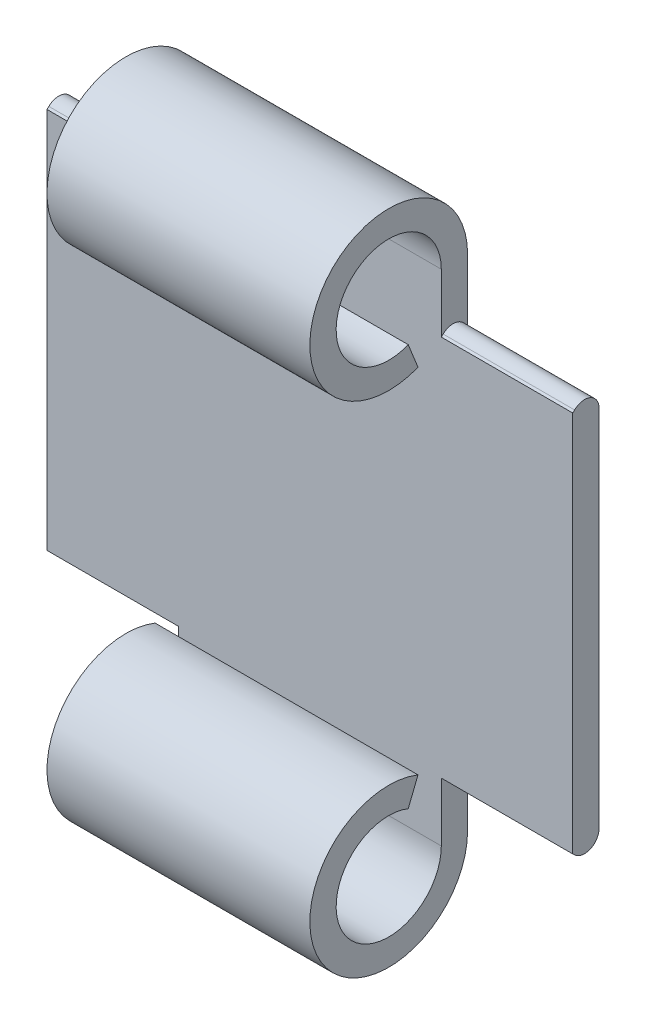
ISO-10303-21;
HEADER;
FILE_DESCRIPTION(('STEP AP214'),'2;1');
FILE_NAME('part.step','',(''),(''),'','','');
FILE_SCHEMA(('AUTOMOTIVE_DESIGN { 1 0 10303 214 1 1 1 1 }'));
ENDSEC;
DATA;
#1=APPLICATION_CONTEXT('core data for automotive mechanical design processes');
#2=APPLICATION_PROTOCOL_DEFINITION('international standard','automotive_design',2000,#1);
#3=PRODUCT_CONTEXT('',#1,'mechanical');
#4=PRODUCT('Part','Part','',(#3));
#5=PRODUCT_RELATED_PRODUCT_CATEGORY('part','',(#4));
#6=PRODUCT_DEFINITION_FORMATION('','',#4);
#7=PRODUCT_DEFINITION_CONTEXT('part definition',#1,'design');
#8=PRODUCT_DEFINITION('design','',#6,#7);
#9=PRODUCT_DEFINITION_SHAPE('','',#8);
#10=(LENGTH_UNIT() NAMED_UNIT(*) SI_UNIT(.MILLI.,.METRE.));
#11=(NAMED_UNIT(*) PLANE_ANGLE_UNIT() SI_UNIT($,.RADIAN.));
#12=(NAMED_UNIT(*) SI_UNIT($,.STERADIAN.) SOLID_ANGLE_UNIT());
#13=UNCERTAINTY_MEASURE_WITH_UNIT(LENGTH_MEASURE(1.E-05),#10,'distance_accuracy_value','');
#14=(GEOMETRIC_REPRESENTATION_CONTEXT(3) GLOBAL_UNCERTAINTY_ASSIGNED_CONTEXT((#13)) GLOBAL_UNIT_ASSIGNED_CONTEXT((#10,
#11,#12)) REPRESENTATION_CONTEXT('',''));
#15=CARTESIAN_POINT('',(0.,0.,0.));
#16=DIRECTION('',(0.,0.,1.));
#17=DIRECTION('',(1.,0.,0.));
#18=AXIS2_PLACEMENT_3D('',#15,#16,#17);
#19=CARTESIAN_POINT('',(0.,0.,2.));
#20=DIRECTION('',(0.,0.,-1.));
#21=DIRECTION('',(-1.,0.,0.));
#22=AXIS2_PLACEMENT_3D('',#19,#20,#21);
#23=PLANE('',#22);
#24=DIRECTION('',(-1.,0.,0.));
#25=VECTOR('',#24,1.);
#26=CARTESIAN_POINT('',(40.,39.5278640450004,2.));
#27=LINE('',#26,#25);
#28=CARTESIAN_POINT('',(30.,39.5278640450004,2.));
#29=VERTEX_POINT('',#28);
#30=CARTESIAN_POINT('',(40.,39.5278640450004,2.));
#31=VERTEX_POINT('',#30);
#32=EDGE_CURVE('E175',#29,#31,#27,.F.);
#33=ORIENTED_EDGE('',*,*,#32,.F.);
#34=DIRECTION('',(0.,-1.,0.));
#35=VECTOR('',#34,1.);
#36=CARTESIAN_POINT('',(30.,0.,2.));
#37=LINE('',#36,#35);
#38=CARTESIAN_POINT('',(30.,44.,1.99999999999993));
#39=VERTEX_POINT('',#38);
#40=EDGE_CURVE('E185',#39,#29,#37,.T.);
#41=ORIENTED_EDGE('',*,*,#40,.F.);
#42=DIRECTION('',(-1.,0.,0.));
#43=VECTOR('',#42,1.);
#44=CARTESIAN_POINT('',(30.,44.,1.99999999999994));
#45=LINE('',#44,#43);
#46=CARTESIAN_POINT('',(10.,44.,1.99999999999994));
#47=VERTEX_POINT('',#46);
#48=EDGE_CURVE('E320',#39,#47,#45,.T.);
#49=ORIENTED_EDGE('',*,*,#48,.T.);
#50=DIRECTION('',(0.,1.,0.));
#51=VECTOR('',#50,1.);
#52=CARTESIAN_POINT('',(10.,0.,2.));
#53=LINE('',#52,#51);
#54=CARTESIAN_POINT('',(10.,39.5278640450004,2.));
#55=VERTEX_POINT('',#54);
#56=EDGE_CURVE('E259',#55,#47,#53,.T.);
#57=ORIENTED_EDGE('',*,*,#56,.F.);
#58=DIRECTION('',(1.,0.,0.));
#59=VECTOR('',#58,1.);
#60=CARTESIAN_POINT('',(0.,39.5278640450004,2.));
#61=LINE('',#60,#59);
#62=CARTESIAN_POINT('',(0.,39.5278640450004,2.));
#63=VERTEX_POINT('',#62);
#64=EDGE_CURVE('E277',#55,#63,#61,.F.);
#65=ORIENTED_EDGE('',*,*,#64,.T.);
#66=DIRECTION('',(0.,-1.,0.));
#67=VECTOR('',#66,1.);
#68=CARTESIAN_POINT('',(0.,0.,2.));
#69=LINE('',#68,#67);
#70=CARTESIAN_POINT('',(0.,10.4721359549996,2.));
#71=VERTEX_POINT('',#70);
#72=EDGE_CURVE('E200',#63,#71,#69,.T.);
#73=ORIENTED_EDGE('',*,*,#72,.T.);
#74=DIRECTION('',(1.,0.,0.));
#75=VECTOR('',#74,1.);
#76=CARTESIAN_POINT('',(0.,10.4721359549996,2.));
#77=LINE('',#76,#75);
#78=CARTESIAN_POINT('',(10.,10.4721359549996,2.));
#79=VERTEX_POINT('',#78);
#80=EDGE_CURVE('E291',#79,#71,#77,.F.);
#81=ORIENTED_EDGE('',*,*,#80,.F.);
#82=DIRECTION('',(0.,1.,0.));
#83=VECTOR('',#82,1.);
#84=CARTESIAN_POINT('',(10.,0.,2.));
#85=LINE('',#84,#83);
#86=CARTESIAN_POINT('',(10.,6.,2.));
#87=VERTEX_POINT('',#86);
#88=EDGE_CURVE('E296',#87,#79,#85,.T.);
#89=ORIENTED_EDGE('',*,*,#88,.F.);
#90=DIRECTION('',(-1.,0.,0.));
#91=VECTOR('',#90,1.);
#92=CARTESIAN_POINT('',(30.,6.,2.));
#93=LINE('',#92,#91);
#94=CARTESIAN_POINT('',(30.,6.,2.));
#95=VERTEX_POINT('',#94);
#96=EDGE_CURVE('E342',#95,#87,#93,.T.);
#97=ORIENTED_EDGE('',*,*,#96,.F.);
#98=DIRECTION('',(0.,-1.,0.));
#99=VECTOR('',#98,1.);
#100=CARTESIAN_POINT('',(30.,0.,2.));
#101=LINE('',#100,#99);
#102=CARTESIAN_POINT('',(30.,10.4721359549996,2.));
#103=VERTEX_POINT('',#102);
#104=EDGE_CURVE('E285',#103,#95,#101,.T.);
#105=ORIENTED_EDGE('',*,*,#104,.F.);
#106=DIRECTION('',(-1.,0.,0.));
#107=VECTOR('',#106,1.);
#108=CARTESIAN_POINT('',(40.,10.4721359549996,2.));
#109=LINE('',#108,#107);
#110=CARTESIAN_POINT('',(40.,10.4721359549996,2.));
#111=VERTEX_POINT('',#110);
#112=EDGE_CURVE('E198',#103,#111,#109,.F.);
#113=ORIENTED_EDGE('',*,*,#112,.T.);
#114=DIRECTION('',(0.,1.,0.));
#115=VECTOR('',#114,1.);
#116=CARTESIAN_POINT('',(40.,0.,2.));
#117=LINE('',#116,#115);
#118=EDGE_CURVE('E191',#111,#31,#117,.T.);
#119=ORIENTED_EDGE('',*,*,#118,.T.);
#120=EDGE_LOOP('',(#33,#41,#49,#57,#65,#73,#81,#89,#97,#105,#113,#119));
#121=FACE_BOUND('',#120,.T.);
#122=ADVANCED_FACE('F37',(#121),#23,.F.);
#123=CARTESIAN_POINT('',(0.,0.,2.));
#124=DIRECTION('',(1.,0.,0.));
#125=DIRECTION('',(0.,0.,-1.));
#126=AXIS2_PLACEMENT_3D('',#123,#124,#125);
#127=PLANE('',#126);
#128=DIRECTION('',(0.,-1.,0.));
#129=VECTOR('',#128,1.);
#130=CARTESIAN_POINT('',(0.,0.,0.));
#131=LINE('',#130,#129);
#132=CARTESIAN_POINT('',(0.,38.8619069685339,0.));
#133=VERTEX_POINT('',#132);
#134=CARTESIAN_POINT('',(0.,11.1380930314661,0.));
#135=VERTEX_POINT('',#134);
#136=EDGE_CURVE('E207',#133,#135,#131,.T.);
#137=ORIENTED_EDGE('',*,*,#136,.T.);
#138=CARTESIAN_POINT('',(0.,11.1380930314661,1.1));
#139=DIRECTION('',(1.,0.,0.));
#140=DIRECTION('',(0.,0.,-1.));
#141=AXIS2_PLACEMENT_3D('',#138,#139,#140);
#142=CIRCLE('',#141,1.1);
#143=CARTESIAN_POINT('',(0.,10.3420504491262,1.85915492957746));
#144=VERTEX_POINT('',#143);
#145=EDGE_CURVE('E229',#135,#144,#142,.F.);
#146=ORIENTED_EDGE('',*,*,#145,.T.);
#147=CARTESIAN_POINT('',(0.,6.,6.));
#148=DIRECTION('',(-1.,0.,0.));
#149=DIRECTION('',(0.,0.,1.));
#150=AXIS2_PLACEMENT_3D('',#147,#148,#149);
#151=CIRCLE('',#150,6.);
#152=EDGE_CURVE('E288',#71,#144,#151,.T.);
#153=ORIENTED_EDGE('',*,*,#152,.F.);
#154=ORIENTED_EDGE('',*,*,#72,.F.);
#155=CARTESIAN_POINT('',(0.,44.,5.99999999999993));
#156=DIRECTION('',(1.,0.,0.));
#157=DIRECTION('',(0.,0.,1.));
#158=AXIS2_PLACEMENT_3D('',#155,#156,#157);
#159=CIRCLE('',#158,6.);
#160=CARTESIAN_POINT('',(0.,39.6579495508737,1.85915492957745));
#161=VERTEX_POINT('',#160);
#162=EDGE_CURVE('E274',#63,#161,#159,.T.);
#163=ORIENTED_EDGE('',*,*,#162,.T.);
#164=CARTESIAN_POINT('',(0.,38.8619069685339,1.1));
#165=DIRECTION('',(1.,0.,0.));
#166=DIRECTION('',(0.,0.,-1.));
#167=AXIS2_PLACEMENT_3D('',#164,#165,#166);
#168=CIRCLE('',#167,1.1);
#169=EDGE_CURVE('E227',#161,#133,#168,.F.);
#170=ORIENTED_EDGE('',*,*,#169,.T.);
#171=EDGE_LOOP('',(#137,#146,#153,#154,#163,#170));
#172=FACE_BOUND('',#171,.T.);
#173=ADVANCED_FACE('F371',(#172),#127,.F.);
#174=CARTESIAN_POINT('',(40.,0.,2.));
#175=DIRECTION('',(-1.,0.,0.));
#176=DIRECTION('',(0.,0.,1.));
#177=AXIS2_PLACEMENT_3D('',#174,#175,#176);
#178=PLANE('',#177);
#179=CARTESIAN_POINT('',(40.,6.,6.));
#180=DIRECTION('',(-1.,0.,0.));
#181=DIRECTION('',(0.,0.,1.));
#182=AXIS2_PLACEMENT_3D('',#179,#180,#181);
#183=CIRCLE('',#182,6.);
#184=CARTESIAN_POINT('',(40.,10.3420504491262,1.85915492957746));
#185=VERTEX_POINT('',#184);
#186=EDGE_CURVE('E258',#111,#185,#183,.T.);
#187=ORIENTED_EDGE('',*,*,#186,.T.);
#188=CARTESIAN_POINT('',(40.,11.1380930314661,1.1));
#189=DIRECTION('',(-1.,0.,0.));
#190=DIRECTION('',(0.,0.,1.));
#191=AXIS2_PLACEMENT_3D('',#188,#189,#190);
#192=CIRCLE('',#191,1.1);
#193=CARTESIAN_POINT('',(40.,11.1380930314661,0.));
#194=VERTEX_POINT('',#193);
#195=EDGE_CURVE('E239',#185,#194,#192,.F.);
#196=ORIENTED_EDGE('',*,*,#195,.T.);
#197=DIRECTION('',(0.,1.,0.));
#198=VECTOR('',#197,1.);
#199=CARTESIAN_POINT('',(40.,0.,0.));
#200=LINE('',#199,#198);
#201=CARTESIAN_POINT('',(40.,38.8619069685339,0.));
#202=VERTEX_POINT('',#201);
#203=EDGE_CURVE('E203',#194,#202,#200,.T.);
#204=ORIENTED_EDGE('',*,*,#203,.T.);
#205=CARTESIAN_POINT('',(40.,38.8619069685339,1.1));
#206=DIRECTION('',(-1.,0.,0.));
#207=DIRECTION('',(0.,0.,1.));
#208=AXIS2_PLACEMENT_3D('',#205,#206,#207);
#209=CIRCLE('',#208,1.1);
#210=CARTESIAN_POINT('',(40.,39.6579495508737,1.85915492957745));
#211=VERTEX_POINT('',#210);
#212=EDGE_CURVE('E194',#202,#211,#209,.F.);
#213=ORIENTED_EDGE('',*,*,#212,.T.);
#214=CARTESIAN_POINT('',(40.,44.,5.99999999999993));
#215=DIRECTION('',(1.,0.,0.));
#216=DIRECTION('',(0.,0.,1.));
#217=AXIS2_PLACEMENT_3D('',#214,#215,#216);
#218=CIRCLE('',#217,6.);
#219=EDGE_CURVE('E179',#31,#211,#218,.T.);
#220=ORIENTED_EDGE('',*,*,#219,.F.);
#221=ORIENTED_EDGE('',*,*,#118,.F.);
#222=EDGE_LOOP('',(#187,#196,#204,#213,#220,#221));
#223=FACE_BOUND('',#222,.T.);
#224=ADVANCED_FACE('F190',(#223),#178,.F.);
#225=CARTESIAN_POINT('',(0.,0.,0.));
#226=DIRECTION('',(0.,0.,-1.));
#227=DIRECTION('',(-1.,0.,0.));
#228=AXIS2_PLACEMENT_3D('',#225,#226,#227);
#229=PLANE('',#228);
#230=DIRECTION('',(0.,1.,0.));
#231=VECTOR('',#230,1.);
#232=CARTESIAN_POINT('',(10.,0.,0.));
#233=LINE('',#232,#231);
#234=CARTESIAN_POINT('',(10.,6.,0.));
#235=VERTEX_POINT('',#234);
#236=CARTESIAN_POINT('',(10.,11.1380930314661,0.));
#237=VERTEX_POINT('',#236);
#238=EDGE_CURVE('E59',#235,#237,#233,.T.);
#239=ORIENTED_EDGE('',*,*,#238,.T.);
#240=DIRECTION('',(1.,0.,0.));
#241=VECTOR('',#240,1.);
#242=CARTESIAN_POINT('',(0.,11.1380930314661,0.));
#243=LINE('',#242,#241);
#244=EDGE_CURVE('E224',#237,#135,#243,.F.);
#245=ORIENTED_EDGE('',*,*,#244,.T.);
#246=ORIENTED_EDGE('',*,*,#136,.F.);
#247=DIRECTION('',(-1.,0.,0.));
#248=VECTOR('',#247,1.);
#249=CARTESIAN_POINT('',(10.,38.8619069685339,0.));
#250=LINE('',#249,#248);
#251=CARTESIAN_POINT('',(10.,38.8619069685339,0.));
#252=VERTEX_POINT('',#251);
#253=EDGE_CURVE('E220',#133,#252,#250,.F.);
#254=ORIENTED_EDGE('',*,*,#253,.T.);
#255=DIRECTION('',(0.,1.,0.));
#256=VECTOR('',#255,1.);
#257=CARTESIAN_POINT('',(10.,0.,0.));
#258=LINE('',#257,#256);
#259=CARTESIAN_POINT('',(10.,44.,0.));
#260=VERTEX_POINT('',#259);
#261=EDGE_CURVE('E218',#252,#260,#258,.T.);
#262=ORIENTED_EDGE('',*,*,#261,.T.);
#263=DIRECTION('',(-1.,0.,0.));
#264=VECTOR('',#263,1.);
#265=CARTESIAN_POINT('',(30.,44.,0.));
#266=LINE('',#265,#264);
#267=CARTESIAN_POINT('',(30.,44.,0.));
#268=VERTEX_POINT('',#267);
#269=EDGE_CURVE('E314',#268,#260,#266,.T.);
#270=ORIENTED_EDGE('',*,*,#269,.F.);
#271=DIRECTION('',(0.,-1.,0.));
#272=VECTOR('',#271,1.);
#273=CARTESIAN_POINT('',(30.,44.,0.));
#274=LINE('',#273,#272);
#275=CARTESIAN_POINT('',(30.,38.8619069685339,0.));
#276=VERTEX_POINT('',#275);
#277=EDGE_CURVE('E51',#268,#276,#274,.T.);
#278=ORIENTED_EDGE('',*,*,#277,.T.);
#279=DIRECTION('',(-1.,0.,0.));
#280=VECTOR('',#279,1.);
#281=CARTESIAN_POINT('',(0.,38.8619069685339,0.));
#282=LINE('',#281,#280);
#283=EDGE_CURVE('E199',#276,#202,#282,.F.);
#284=ORIENTED_EDGE('',*,*,#283,.T.);
#285=ORIENTED_EDGE('',*,*,#203,.F.);
#286=DIRECTION('',(1.,0.,0.));
#287=VECTOR('',#286,1.);
#288=CARTESIAN_POINT('',(30.,11.1380930314661,0.));
#289=LINE('',#288,#287);
#290=CARTESIAN_POINT('',(30.,11.1380930314661,0.));
#291=VERTEX_POINT('',#290);
#292=EDGE_CURVE('E215',#194,#291,#289,.F.);
#293=ORIENTED_EDGE('',*,*,#292,.T.);
#294=DIRECTION('',(0.,-1.,0.));
#295=VECTOR('',#294,1.);
#296=CARTESIAN_POINT('',(30.,6.,0.));
#297=LINE('',#296,#295);
#298=CARTESIAN_POINT('',(30.,6.,0.));
#299=VERTEX_POINT('',#298);
#300=EDGE_CURVE('E213',#291,#299,#297,.T.);
#301=ORIENTED_EDGE('',*,*,#300,.T.);
#302=DIRECTION('',(-1.,0.,0.));
#303=VECTOR('',#302,1.);
#304=CARTESIAN_POINT('',(30.,6.,0.));
#305=LINE('',#304,#303);
#306=EDGE_CURVE('E210',#299,#235,#305,.T.);
#307=ORIENTED_EDGE('',*,*,#306,.T.);
#308=EDGE_LOOP('',(#239,#245,#246,#254,#262,#270,#278,#284,#285,#293,#301,#307));
#309=FACE_BOUND('',#308,.T.);
#310=ADVANCED_FACE('F265',(#309),#229,.T.);
#311=CARTESIAN_POINT('',(30.,6.,6.));
#312=DIRECTION('',(-1.,0.,0.));
#313=DIRECTION('',(0.,0.,1.));
#314=AXIS2_PLACEMENT_3D('',#311,#312,#313);
#315=CYLINDRICAL_SURFACE('',#314,4.);
#316=ORIENTED_EDGE('',*,*,#96,.T.);
#317=CARTESIAN_POINT('',(10.,6.,6.));
#318=DIRECTION('',(1.,0.,0.));
#319=DIRECTION('',(0.,0.,1.));
#320=AXIS2_PLACEMENT_3D('',#317,#318,#319);
#321=CIRCLE('',#320,4.);
#322=CARTESIAN_POINT('',(10.,9.71415879447013,4.51506752696959));
#323=VERTEX_POINT('',#322);
#324=EDGE_CURVE('E329',#323,#87,#321,.T.);
#325=ORIENTED_EDGE('',*,*,#324,.F.);
#326=DIRECTION('',(-1.,0.,0.));
#327=VECTOR('',#326,1.);
#328=CARTESIAN_POINT('',(30.,9.71415879447013,4.51506752696959));
#329=LINE('',#328,#327);
#330=CARTESIAN_POINT('',(30.,9.71415879447013,4.51506752696959));
#331=VERTEX_POINT('',#330);
#332=EDGE_CURVE('E345',#331,#323,#329,.T.);
#333=ORIENTED_EDGE('',*,*,#332,.F.);
#334=CARTESIAN_POINT('',(30.,6.,6.));
#335=DIRECTION('',(1.,0.,0.));
#336=DIRECTION('',(0.,0.,1.));
#337=AXIS2_PLACEMENT_3D('',#334,#335,#336);
#338=CIRCLE('',#337,4.);
#339=EDGE_CURVE('E337',#331,#95,#338,.T.);
#340=ORIENTED_EDGE('',*,*,#339,.T.);
#341=EDGE_LOOP('',(#316,#325,#333,#340));
#342=FACE_BOUND('',#341,.T.);
#343=ADVANCED_FACE('F359',(#342),#315,.F.);
#344=CARTESIAN_POINT('',(30.,11.5712381917052,3.77260129045439));
#345=DIRECTION('',(0.,-0.3712331182576,-0.928539698617533));
#346=DIRECTION('',(0.,0.928539698617533,-0.3712331182576));
#347=AXIS2_PLACEMENT_3D('',#344,#345,#346);
#348=PLANE('',#347);
#349=ORIENTED_EDGE('',*,*,#332,.T.);
#350=DIRECTION('',(0.,-0.928539698617533,0.3712331182576));
#351=VECTOR('',#350,1.);
#352=CARTESIAN_POINT('',(10.,11.5712381917052,3.77260129045439));
#353=LINE('',#352,#351);
#354=CARTESIAN_POINT('',(10.,11.5712381917052,3.77260129045439));
#355=VERTEX_POINT('',#354);
#356=EDGE_CURVE('E326',#355,#323,#353,.T.);
#357=ORIENTED_EDGE('',*,*,#356,.F.);
#358=DIRECTION('',(-1.,0.,0.));
#359=VECTOR('',#358,1.);
#360=CARTESIAN_POINT('',(30.,11.5712381917052,3.77260129045439));
#361=LINE('',#360,#359);
#362=CARTESIAN_POINT('',(30.,11.5712381917052,3.77260129045439));
#363=VERTEX_POINT('',#362);
#364=EDGE_CURVE('E340',#363,#355,#361,.T.);
#365=ORIENTED_EDGE('',*,*,#364,.F.);
#366=DIRECTION('',(0.,-0.928539698617533,0.3712331182576));
#367=VECTOR('',#366,1.);
#368=CARTESIAN_POINT('',(30.,11.5712381917052,3.77260129045439));
#369=LINE('',#368,#367);
#370=EDGE_CURVE('E334',#363,#331,#369,.T.);
#371=ORIENTED_EDGE('',*,*,#370,.T.);
#372=EDGE_LOOP('',(#349,#357,#365,#371));
#373=FACE_BOUND('',#372,.T.);
#374=ADVANCED_FACE('F356',(#373),#348,.T.);
#375=CARTESIAN_POINT('',(30.,6.,6.));
#376=DIRECTION('',(-1.,0.,0.));
#377=DIRECTION('',(0.,0.,1.));
#378=AXIS2_PLACEMENT_3D('',#375,#376,#377);
#379=CYLINDRICAL_SURFACE('',#378,6.);
#380=ORIENTED_EDGE('',*,*,#364,.T.);
#381=CARTESIAN_POINT('',(10.,6.,6.));
#382=DIRECTION('',(-1.,0.,0.));
#383=DIRECTION('',(0.,0.,1.));
#384=AXIS2_PLACEMENT_3D('',#381,#382,#383);
#385=CIRCLE('',#384,6.);
#386=EDGE_CURVE('E317',#235,#355,#385,.T.);
#387=ORIENTED_EDGE('',*,*,#386,.F.);
#388=ORIENTED_EDGE('',*,*,#306,.F.);
#389=CARTESIAN_POINT('',(30.,6.,6.));
#390=DIRECTION('',(-1.,0.,0.));
#391=DIRECTION('',(0.,0.,1.));
#392=AXIS2_PLACEMENT_3D('',#389,#390,#391);
#393=CIRCLE('',#392,6.);
#394=EDGE_CURVE('E332',#299,#363,#393,.T.);
#395=ORIENTED_EDGE('',*,*,#394,.T.);
#396=EDGE_LOOP('',(#380,#387,#388,#395));
#397=FACE_BOUND('',#396,.T.);
#398=ADVANCED_FACE('F349',(#397),#379,.T.);
#399=CARTESIAN_POINT('',(30.,6.,6.));
#400=DIRECTION('',(-1.,0.,0.));
#401=DIRECTION('',(0.,0.,1.));
#402=AXIS2_PLACEMENT_3D('',#399,#400,#401);
#403=PLANE('',#402);
#404=ORIENTED_EDGE('',*,*,#394,.F.);
#405=ORIENTED_EDGE('',*,*,#300,.F.);
#406=CARTESIAN_POINT('',(30.,11.1380930314661,1.1));
#407=DIRECTION('',(-1.,0.,0.));
#408=DIRECTION('',(0.,0.,1.));
#409=AXIS2_PLACEMENT_3D('',#406,#407,#408);
#410=CIRCLE('',#409,1.1);
#411=CARTESIAN_POINT('',(30.,10.3420504491262,1.85915492957746));
#412=VERTEX_POINT('',#411);
#413=EDGE_CURVE('E45',#291,#412,#410,.T.);
#414=ORIENTED_EDGE('',*,*,#413,.T.);
#415=CARTESIAN_POINT('',(30.,6.,6.));
#416=DIRECTION('',(-1.,0.,0.));
#417=DIRECTION('',(0.,0.,1.));
#418=AXIS2_PLACEMENT_3D('',#415,#416,#417);
#419=CIRCLE('',#418,6.);
#420=EDGE_CURVE('E252',#103,#412,#419,.T.);
#421=ORIENTED_EDGE('',*,*,#420,.F.);
#422=ORIENTED_EDGE('',*,*,#104,.T.);
#423=ORIENTED_EDGE('',*,*,#339,.F.);
#424=ORIENTED_EDGE('',*,*,#370,.F.);
#425=EDGE_LOOP('',(#404,#405,#414,#421,#422,#423,#424));
#426=FACE_BOUND('',#425,.T.);
#427=ADVANCED_FACE('F251',(#426),#403,.F.);
#428=CARTESIAN_POINT('',(10.,6.,6.));
#429=DIRECTION('',(-1.,0.,0.));
#430=DIRECTION('',(0.,0.,1.));
#431=AXIS2_PLACEMENT_3D('',#428,#429,#430);
#432=PLANE('',#431);
#433=ORIENTED_EDGE('',*,*,#386,.T.);
#434=ORIENTED_EDGE('',*,*,#356,.T.);
#435=ORIENTED_EDGE('',*,*,#324,.T.);
#436=ORIENTED_EDGE('',*,*,#88,.T.);
#437=CARTESIAN_POINT('',(10.,6.,6.));
#438=DIRECTION('',(-1.,0.,0.));
#439=DIRECTION('',(0.,0.,1.));
#440=AXIS2_PLACEMENT_3D('',#437,#438,#439);
#441=CIRCLE('',#440,6.);
#442=CARTESIAN_POINT('',(10.,10.3420504491262,1.85915492957746));
#443=VERTEX_POINT('',#442);
#444=EDGE_CURVE('E287',#79,#443,#441,.T.);
#445=ORIENTED_EDGE('',*,*,#444,.T.);
#446=CARTESIAN_POINT('',(10.,11.1380930314661,1.1));
#447=DIRECTION('',(-1.,0.,0.));
#448=DIRECTION('',(0.,0.,1.));
#449=AXIS2_PLACEMENT_3D('',#446,#447,#448);
#450=CIRCLE('',#449,1.1);
#451=EDGE_CURVE('E243',#443,#237,#450,.F.);
#452=ORIENTED_EDGE('',*,*,#451,.T.);
#453=ORIENTED_EDGE('',*,*,#238,.F.);
#454=EDGE_LOOP('',(#433,#434,#435,#436,#445,#452,#453));
#455=FACE_BOUND('',#454,.T.);
#456=ADVANCED_FACE('F354',(#455),#432,.T.);
#457=CARTESIAN_POINT('',(30.,44.,5.99999999999993));
#458=DIRECTION('',(-1.,0.,0.));
#459=DIRECTION('',(0.,-1.,0.));
#460=AXIS2_PLACEMENT_3D('',#457,#458,#459);
#461=CYLINDRICAL_SURFACE('',#460,6.);
#462=ORIENTED_EDGE('',*,*,#269,.T.);
#463=CARTESIAN_POINT('',(10.,44.,5.99999999999993));
#464=DIRECTION('',(1.,0.,0.));
#465=DIRECTION('',(0.,0.,1.));
#466=AXIS2_PLACEMENT_3D('',#463,#464,#465);
#467=CIRCLE('',#466,6.);
#468=CARTESIAN_POINT('',(10.,38.4287618082948,3.77260129045434));
#469=VERTEX_POINT('',#468);
#470=EDGE_CURVE('E298',#260,#469,#467,.T.);
#471=ORIENTED_EDGE('',*,*,#470,.T.);
#472=DIRECTION('',(-1.,0.,0.));
#473=VECTOR('',#472,1.);
#474=CARTESIAN_POINT('',(30.,38.4287618082948,3.77260129045434));
#475=LINE('',#474,#473);
#476=CARTESIAN_POINT('',(30.,38.4287618082948,3.77260129045434));
#477=VERTEX_POINT('',#476);
#478=EDGE_CURVE('E315',#477,#469,#475,.T.);
#479=ORIENTED_EDGE('',*,*,#478,.F.);
#480=CARTESIAN_POINT('',(30.,44.,5.99999999999993));
#481=DIRECTION('',(1.,0.,0.));
#482=DIRECTION('',(0.,0.,1.));
#483=AXIS2_PLACEMENT_3D('',#480,#481,#482);
#484=CIRCLE('',#483,6.);
#485=EDGE_CURVE('E307',#268,#477,#484,.T.);
#486=ORIENTED_EDGE('',*,*,#485,.F.);
#487=EDGE_LOOP('',(#462,#471,#479,#486));
#488=FACE_BOUND('',#487,.T.);
#489=ADVANCED_FACE('F399',(#488),#461,.T.);
#490=CARTESIAN_POINT('',(30.,38.4287618082948,3.77260129045434));
#491=DIRECTION('',(0.,-0.371233118257597,0.928539698617534));
#492=DIRECTION('',(0.,-0.928539698617534,-0.371233118257597));
#493=AXIS2_PLACEMENT_3D('',#490,#491,#492);
#494=PLANE('',#493);
#495=ORIENTED_EDGE('',*,*,#478,.T.);
#496=DIRECTION('',(0.,0.928539698617534,0.371233118257597));
#497=VECTOR('',#496,1.);
#498=CARTESIAN_POINT('',(10.,38.4287618082948,3.77260129045434));
#499=LINE('',#498,#497);
#500=CARTESIAN_POINT('',(10.,40.2858412055299,4.51506752696954));
#501=VERTEX_POINT('',#500);
#502=EDGE_CURVE('E304',#469,#501,#499,.T.);
#503=ORIENTED_EDGE('',*,*,#502,.T.);
#504=DIRECTION('',(-1.,0.,0.));
#505=VECTOR('',#504,1.);
#506=CARTESIAN_POINT('',(30.,40.2858412055299,4.51506752696954));
#507=LINE('',#506,#505);
#508=CARTESIAN_POINT('',(30.,40.2858412055299,4.51506752696954));
#509=VERTEX_POINT('',#508);
#510=EDGE_CURVE('E318',#509,#501,#507,.T.);
#511=ORIENTED_EDGE('',*,*,#510,.F.);
#512=DIRECTION('',(0.,0.928539698617534,0.371233118257597));
#513=VECTOR('',#512,1.);
#514=CARTESIAN_POINT('',(30.,38.4287618082948,3.77260129045434));
#515=LINE('',#514,#513);
#516=EDGE_CURVE('E311',#477,#509,#515,.T.);
#517=ORIENTED_EDGE('',*,*,#516,.F.);
#518=EDGE_LOOP('',(#495,#503,#511,#517));
#519=FACE_BOUND('',#518,.T.);
#520=ADVANCED_FACE('F394',(#519),#494,.F.);
#521=CARTESIAN_POINT('',(30.,44.,5.99999999999993));
#522=DIRECTION('',(-1.,0.,0.));
#523=DIRECTION('',(0.,-1.,0.));
#524=AXIS2_PLACEMENT_3D('',#521,#522,#523);
#525=CYLINDRICAL_SURFACE('',#524,4.);
#526=ORIENTED_EDGE('',*,*,#510,.T.);
#527=CARTESIAN_POINT('',(10.,44.,5.99999999999993));
#528=DIRECTION('',(-1.,0.,0.));
#529=DIRECTION('',(0.,0.,1.));
#530=AXIS2_PLACEMENT_3D('',#527,#528,#529);
#531=CIRCLE('',#530,4.);
#532=EDGE_CURVE('E301',#501,#47,#531,.T.);
#533=ORIENTED_EDGE('',*,*,#532,.T.);
#534=ORIENTED_EDGE('',*,*,#48,.F.);
#535=CARTESIAN_POINT('',(30.,44.,5.99999999999993));
#536=DIRECTION('',(-1.,0.,0.));
#537=DIRECTION('',(0.,0.,1.));
#538=AXIS2_PLACEMENT_3D('',#535,#536,#537);
#539=CIRCLE('',#538,4.);
#540=EDGE_CURVE('E309',#509,#39,#539,.T.);
#541=ORIENTED_EDGE('',*,*,#540,.F.);
#542=EDGE_LOOP('',(#526,#533,#534,#541));
#543=FACE_BOUND('',#542,.T.);
#544=ADVANCED_FACE('F390',(#543),#525,.F.);
#545=CARTESIAN_POINT('',(30.,44.,5.99999999999993));
#546=DIRECTION('',(-1.,0.,0.));
#547=DIRECTION('',(0.,0.,1.));
#548=AXIS2_PLACEMENT_3D('',#545,#546,#547);
#549=PLANE('',#548);
#550=ORIENTED_EDGE('',*,*,#485,.T.);
#551=ORIENTED_EDGE('',*,*,#516,.T.);
#552=ORIENTED_EDGE('',*,*,#540,.T.);
#553=ORIENTED_EDGE('',*,*,#40,.T.);
#554=CARTESIAN_POINT('',(30.,44.,5.99999999999993));
#555=DIRECTION('',(1.,0.,0.));
#556=DIRECTION('',(0.,0.,1.));
#557=AXIS2_PLACEMENT_3D('',#554,#555,#556);
#558=CIRCLE('',#557,6.);
#559=CARTESIAN_POINT('',(30.,39.6579495508737,1.85915492957745));
#560=VERTEX_POINT('',#559);
#561=EDGE_CURVE('E182',#29,#560,#558,.T.);
#562=ORIENTED_EDGE('',*,*,#561,.T.);
#563=CARTESIAN_POINT('',(30.,38.8619069685339,1.1));
#564=DIRECTION('',(-1.,0.,0.));
#565=DIRECTION('',(0.,-1.,0.));
#566=AXIS2_PLACEMENT_3D('',#563,#564,#565);
#567=CIRCLE('',#566,1.1);
#568=EDGE_CURVE('E11',#560,#276,#567,.T.);
#569=ORIENTED_EDGE('',*,*,#568,.T.);
#570=ORIENTED_EDGE('',*,*,#277,.F.);
#571=EDGE_LOOP('',(#550,#551,#552,#553,#562,#569,#570));
#572=FACE_BOUND('',#571,.T.);
#573=ADVANCED_FACE('F268',(#572),#549,.F.);
#574=CARTESIAN_POINT('',(10.,44.,5.99999999999993));
#575=DIRECTION('',(-1.,0.,0.));
#576=DIRECTION('',(0.,0.,1.));
#577=AXIS2_PLACEMENT_3D('',#574,#575,#576);
#578=PLANE('',#577);
#579=ORIENTED_EDGE('',*,*,#470,.F.);
#580=ORIENTED_EDGE('',*,*,#261,.F.);
#581=CARTESIAN_POINT('',(10.,38.8619069685339,1.1));
#582=DIRECTION('',(-1.,0.,0.));
#583=DIRECTION('',(0.,-1.,0.));
#584=AXIS2_PLACEMENT_3D('',#581,#582,#583);
#585=CIRCLE('',#584,1.1);
#586=CARTESIAN_POINT('',(10.,39.6579495508737,1.85915492957745));
#587=VERTEX_POINT('',#586);
#588=EDGE_CURVE('E245',#252,#587,#585,.F.);
#589=ORIENTED_EDGE('',*,*,#588,.T.);
#590=CARTESIAN_POINT('',(10.,44.,5.99999999999993));
#591=DIRECTION('',(1.,0.,0.));
#592=DIRECTION('',(0.,0.,1.));
#593=AXIS2_PLACEMENT_3D('',#590,#591,#592);
#594=CIRCLE('',#593,6.);
#595=EDGE_CURVE('E273',#55,#587,#594,.T.);
#596=ORIENTED_EDGE('',*,*,#595,.F.);
#597=ORIENTED_EDGE('',*,*,#56,.T.);
#598=ORIENTED_EDGE('',*,*,#532,.F.);
#599=ORIENTED_EDGE('',*,*,#502,.F.);
#600=EDGE_LOOP('',(#579,#580,#589,#596,#597,#598,#599));
#601=FACE_BOUND('',#600,.T.);
#602=ADVANCED_FACE('F386',(#601),#578,.T.);
#603=CARTESIAN_POINT('',(0.,6.,6.));
#604=DIRECTION('',(1.,0.,0.));
#605=DIRECTION('',(0.,0.,-1.));
#606=AXIS2_PLACEMENT_3D('',#603,#604,#605);
#607=CYLINDRICAL_SURFACE('',#606,6.);
#608=ORIENTED_EDGE('',*,*,#152,.T.);
#609=DIRECTION('',(1.,0.,0.));
#610=VECTOR('',#609,1.);
#611=CARTESIAN_POINT('',(0.,10.3420504491262,1.85915492957746));
#612=LINE('',#611,#610);
#613=EDGE_CURVE('E231',#144,#443,#612,.T.);
#614=ORIENTED_EDGE('',*,*,#613,.T.);
#615=ORIENTED_EDGE('',*,*,#444,.F.);
#616=ORIENTED_EDGE('',*,*,#80,.T.);
#617=EDGE_LOOP('',(#608,#614,#615,#616));
#618=FACE_BOUND('',#617,.T.);
#619=ADVANCED_FACE('F365',(#618),#607,.F.);
#620=CARTESIAN_POINT('',(40.,6.,6.));
#621=DIRECTION('',(-1.,0.,0.));
#622=DIRECTION('',(0.,0.,1.));
#623=AXIS2_PLACEMENT_3D('',#620,#621,#622);
#624=CYLINDRICAL_SURFACE('',#623,6.);
#625=ORIENTED_EDGE('',*,*,#420,.T.);
#626=DIRECTION('',(-1.,0.,0.));
#627=VECTOR('',#626,1.);
#628=CARTESIAN_POINT('',(40.,10.3420504491262,1.85915492957746));
#629=LINE('',#628,#627);
#630=EDGE_CURVE('E236',#412,#185,#629,.F.);
#631=ORIENTED_EDGE('',*,*,#630,.T.);
#632=ORIENTED_EDGE('',*,*,#186,.F.);
#633=ORIENTED_EDGE('',*,*,#112,.F.);
#634=EDGE_LOOP('',(#625,#631,#632,#633));
#635=FACE_BOUND('',#634,.T.);
#636=ADVANCED_FACE('F257',(#635),#624,.F.);
#637=CARTESIAN_POINT('',(0.,44.,5.99999999999993));
#638=DIRECTION('',(1.,0.,0.));
#639=DIRECTION('',(0.,1.,0.));
#640=AXIS2_PLACEMENT_3D('',#637,#638,#639);
#641=CYLINDRICAL_SURFACE('',#640,6.);
#642=ORIENTED_EDGE('',*,*,#595,.T.);
#643=DIRECTION('',(1.,0.,0.));
#644=VECTOR('',#643,1.);
#645=CARTESIAN_POINT('',(0.,39.6579495508737,1.85915492957745));
#646=LINE('',#645,#644);
#647=EDGE_CURVE('E233',#587,#161,#646,.F.);
#648=ORIENTED_EDGE('',*,*,#647,.T.);
#649=ORIENTED_EDGE('',*,*,#162,.F.);
#650=ORIENTED_EDGE('',*,*,#64,.F.);
#651=EDGE_LOOP('',(#642,#648,#649,#650));
#652=FACE_BOUND('',#651,.T.);
#653=ADVANCED_FACE('F382',(#652),#641,.F.);
#654=CARTESIAN_POINT('',(40.,44.,5.99999999999993));
#655=DIRECTION('',(-1.,0.,0.));
#656=DIRECTION('',(0.,-1.,0.));
#657=AXIS2_PLACEMENT_3D('',#654,#655,#656);
#658=CYLINDRICAL_SURFACE('',#657,6.);
#659=ORIENTED_EDGE('',*,*,#219,.T.);
#660=DIRECTION('',(-1.,0.,0.));
#661=VECTOR('',#660,1.);
#662=CARTESIAN_POINT('',(40.,39.6579495508737,1.85915492957745));
#663=LINE('',#662,#661);
#664=EDGE_CURVE('E241',#211,#560,#663,.T.);
#665=ORIENTED_EDGE('',*,*,#664,.T.);
#666=ORIENTED_EDGE('',*,*,#561,.F.);
#667=ORIENTED_EDGE('',*,*,#32,.T.);
#668=EDGE_LOOP('',(#659,#665,#666,#667));
#669=FACE_BOUND('',#668,.T.);
#670=ADVANCED_FACE('F177',(#669),#658,.F.);
#671=CARTESIAN_POINT('',(0.,11.1380930314661,1.1));
#672=DIRECTION('',(1.,0.,0.));
#673=DIRECTION('',(0.,0.,-1.));
#674=AXIS2_PLACEMENT_3D('',#671,#672,#673);
#675=CYLINDRICAL_SURFACE('',#674,1.1);
#676=ORIENTED_EDGE('',*,*,#451,.F.);
#677=ORIENTED_EDGE('',*,*,#613,.F.);
#678=ORIENTED_EDGE('',*,*,#145,.F.);
#679=ORIENTED_EDGE('',*,*,#244,.F.);
#680=EDGE_LOOP('',(#676,#677,#678,#679));
#681=FACE_BOUND('',#680,.T.);
#682=ADVANCED_FACE('F373',(#681),#675,.T.);
#683=CARTESIAN_POINT('',(0.,38.8619069685339,1.1));
#684=DIRECTION('',(1.,0.,0.));
#685=DIRECTION('',(0.,1.,0.));
#686=AXIS2_PLACEMENT_3D('',#683,#684,#685);
#687=CYLINDRICAL_SURFACE('',#686,1.1);
#688=ORIENTED_EDGE('',*,*,#588,.F.);
#689=ORIENTED_EDGE('',*,*,#253,.F.);
#690=ORIENTED_EDGE('',*,*,#169,.F.);
#691=ORIENTED_EDGE('',*,*,#647,.F.);
#692=EDGE_LOOP('',(#688,#689,#690,#691));
#693=FACE_BOUND('',#692,.T.);
#694=ADVANCED_FACE('F380',(#693),#687,.T.);
#695=CARTESIAN_POINT('',(40.,11.1380930314661,1.1));
#696=DIRECTION('',(-1.,0.,0.));
#697=DIRECTION('',(0.,0.,1.));
#698=AXIS2_PLACEMENT_3D('',#695,#696,#697);
#699=CYLINDRICAL_SURFACE('',#698,1.1);
#700=ORIENTED_EDGE('',*,*,#195,.F.);
#701=ORIENTED_EDGE('',*,*,#630,.F.);
#702=ORIENTED_EDGE('',*,*,#413,.F.);
#703=ORIENTED_EDGE('',*,*,#292,.F.);
#704=EDGE_LOOP('',(#700,#701,#702,#703));
#705=FACE_BOUND('',#704,.T.);
#706=ADVANCED_FACE('F262',(#705),#699,.T.);
#707=CARTESIAN_POINT('',(40.,38.8619069685339,1.1));
#708=DIRECTION('',(-1.,0.,0.));
#709=DIRECTION('',(0.,-1.,0.));
#710=AXIS2_PLACEMENT_3D('',#707,#708,#709);
#711=CYLINDRICAL_SURFACE('',#710,1.1);
#712=ORIENTED_EDGE('',*,*,#212,.F.);
#713=ORIENTED_EDGE('',*,*,#283,.F.);
#714=ORIENTED_EDGE('',*,*,#568,.F.);
#715=ORIENTED_EDGE('',*,*,#664,.F.);
#716=EDGE_LOOP('',(#712,#713,#714,#715));
#717=FACE_BOUND('',#716,.T.);
#718=ADVANCED_FACE('F39',(#717),#711,.T.);
#719=CLOSED_SHELL('',(#122,#173,#224,#310,#343,#374,#398,#427,#456,#489,#520,#544,#573,#602,
#619,#636,#653,#670,#682,#694,#706,#718));
#720=MANIFOLD_SOLID_BREP('B2',#719);
#721=ADVANCED_BREP_SHAPE_REPRESENTATION('',(#18,#720),#14);
#722=SHAPE_DEFINITION_REPRESENTATION(#9,#721);
ENDSEC;
END-ISO-10303-21;
